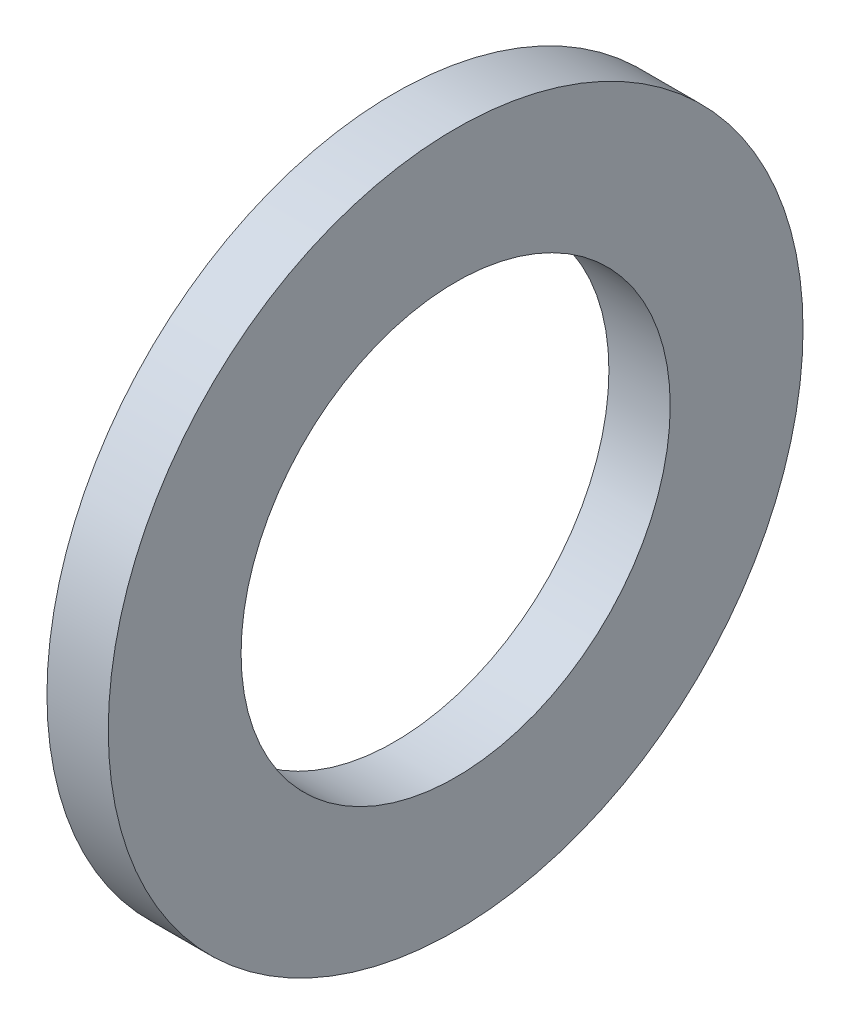
ISO-10303-21;
HEADER;
FILE_DESCRIPTION(('STEP AP214'),'2;1');
FILE_NAME('part.step','',(''),(''),'','','');
FILE_SCHEMA(('AUTOMOTIVE_DESIGN { 1 0 10303 214 1 1 1 1 }'));
ENDSEC;
DATA;
#1=APPLICATION_CONTEXT('core data for automotive mechanical design processes');
#2=APPLICATION_PROTOCOL_DEFINITION('international standard','automotive_design',2000,#1);
#3=PRODUCT_CONTEXT('',#1,'mechanical');
#4=PRODUCT('Part','Part','',(#3));
#5=PRODUCT_RELATED_PRODUCT_CATEGORY('part','',(#4));
#6=PRODUCT_DEFINITION_FORMATION('','',#4);
#7=PRODUCT_DEFINITION_CONTEXT('part definition',#1,'design');
#8=PRODUCT_DEFINITION('design','',#6,#7);
#9=PRODUCT_DEFINITION_SHAPE('','',#8);
#10=(LENGTH_UNIT() NAMED_UNIT(*) SI_UNIT(.MILLI.,.METRE.));
#11=(NAMED_UNIT(*) PLANE_ANGLE_UNIT() SI_UNIT($,.RADIAN.));
#12=(NAMED_UNIT(*) SI_UNIT($,.STERADIAN.) SOLID_ANGLE_UNIT());
#13=UNCERTAINTY_MEASURE_WITH_UNIT(LENGTH_MEASURE(1.E-05),#10,'distance_accuracy_value','');
#14=(GEOMETRIC_REPRESENTATION_CONTEXT(3) GLOBAL_UNCERTAINTY_ASSIGNED_CONTEXT((#13)) GLOBAL_UNIT_ASSIGNED_CONTEXT((#10,
#11,#12)) REPRESENTATION_CONTEXT('',''));
#15=CARTESIAN_POINT('',(0.,0.,0.));
#16=DIRECTION('',(0.,0.,1.));
#17=DIRECTION('',(1.,0.,0.));
#18=AXIS2_PLACEMENT_3D('',#15,#16,#17);
#19=CARTESIAN_POINT('',(-34.9249999999999,0.,0.));
#20=DIRECTION('',(-1.,0.,0.));
#21=DIRECTION('',(0.,0.,1.));
#22=AXIS2_PLACEMENT_3D('',#19,#20,#21);
#23=CYLINDRICAL_SURFACE('',#22,10.5);
#24=CARTESIAN_POINT('',(0.,0.,0.));
#25=DIRECTION('',(-1.,0.,0.));
#26=DIRECTION('',(0.,0.,1.));
#27=AXIS2_PLACEMENT_3D('',#24,#25,#26);
#28=CIRCLE('',#27,10.5);
#29=CARTESIAN_POINT('',(0.,0.,10.5));
#30=VERTEX_POINT('',#29);
#31=EDGE_CURVE('E10',#30,#30,#28,.T.);
#32=ORIENTED_EDGE('',*,*,#31,.F.);
#33=EDGE_LOOP('',(#32));
#34=FACE_BOUND('',#33,.T.);
#35=CARTESIAN_POINT('',(-3.,0.,0.));
#36=DIRECTION('',(-1.,0.,0.));
#37=DIRECTION('',(0.,0.,1.));
#38=AXIS2_PLACEMENT_3D('',#35,#36,#37);
#39=CIRCLE('',#38,10.5);
#40=CARTESIAN_POINT('',(-3.,0.,10.5));
#41=VERTEX_POINT('',#40);
#42=EDGE_CURVE('E44',#41,#41,#39,.T.);
#43=ORIENTED_EDGE('',*,*,#42,.T.);
#44=EDGE_LOOP('',(#43));
#45=FACE_BOUND('',#44,.T.);
#46=ADVANCED_FACE('F30',(#34,#45),#23,.F.);
#47=CARTESIAN_POINT('',(0.,10.5,0.));
#48=DIRECTION('',(-1.,0.,0.));
#49=DIRECTION('',(0.,0.,1.));
#50=AXIS2_PLACEMENT_3D('',#47,#48,#49);
#51=PLANE('',#50);
#52=CARTESIAN_POINT('',(0.,0.,0.));
#53=DIRECTION('',(-1.,0.,0.));
#54=DIRECTION('',(0.,0.,1.));
#55=AXIS2_PLACEMENT_3D('',#52,#53,#54);
#56=CIRCLE('',#55,17.);
#57=CARTESIAN_POINT('',(0.,0.,17.));
#58=VERTEX_POINT('',#57);
#59=EDGE_CURVE('E36',#58,#58,#56,.T.);
#60=ORIENTED_EDGE('',*,*,#59,.F.);
#61=EDGE_LOOP('',(#60));
#62=FACE_BOUND('',#61,.T.);
#63=ORIENTED_EDGE('',*,*,#31,.T.);
#64=EDGE_LOOP('',(#63));
#65=FACE_BOUND('',#64,.T.);
#66=ADVANCED_FACE('F59',(#62,#65),#51,.F.);
#67=CARTESIAN_POINT('',(-34.9249999999999,0.,0.));
#68=DIRECTION('',(-1.,0.,0.));
#69=DIRECTION('',(0.,0.,1.));
#70=AXIS2_PLACEMENT_3D('',#67,#68,#69);
#71=CYLINDRICAL_SURFACE('',#70,17.);
#72=CARTESIAN_POINT('',(-3.,0.,0.));
#73=DIRECTION('',(-1.,0.,0.));
#74=DIRECTION('',(0.,0.,1.));
#75=AXIS2_PLACEMENT_3D('',#72,#73,#74);
#76=CIRCLE('',#75,17.);
#77=CARTESIAN_POINT('',(-3.,0.,17.));
#78=VERTEX_POINT('',#77);
#79=EDGE_CURVE('E40',#78,#78,#76,.T.);
#80=ORIENTED_EDGE('',*,*,#79,.F.);
#81=EDGE_LOOP('',(#80));
#82=FACE_BOUND('',#81,.T.);
#83=ORIENTED_EDGE('',*,*,#59,.T.);
#84=EDGE_LOOP('',(#83));
#85=FACE_BOUND('',#84,.T.);
#86=ADVANCED_FACE('F54',(#82,#85),#71,.T.);
#87=CARTESIAN_POINT('',(-3.,17.,0.));
#88=DIRECTION('',(1.,0.,0.));
#89=DIRECTION('',(0.,0.,-1.));
#90=AXIS2_PLACEMENT_3D('',#87,#88,#89);
#91=PLANE('',#90);
#92=ORIENTED_EDGE('',*,*,#42,.F.);
#93=EDGE_LOOP('',(#92));
#94=FACE_BOUND('',#93,.T.);
#95=ORIENTED_EDGE('',*,*,#79,.T.);
#96=EDGE_LOOP('',(#95));
#97=FACE_BOUND('',#96,.T.);
#98=ADVANCED_FACE('F51',(#94,#97),#91,.F.);
#99=CLOSED_SHELL('',(#46,#66,#86,#98));
#100=MANIFOLD_SOLID_BREP('B2',#99);
#101=ADVANCED_BREP_SHAPE_REPRESENTATION('',(#18,#100),#14);
#102=SHAPE_DEFINITION_REPRESENTATION(#9,#101);
ENDSEC;
END-ISO-10303-21;
